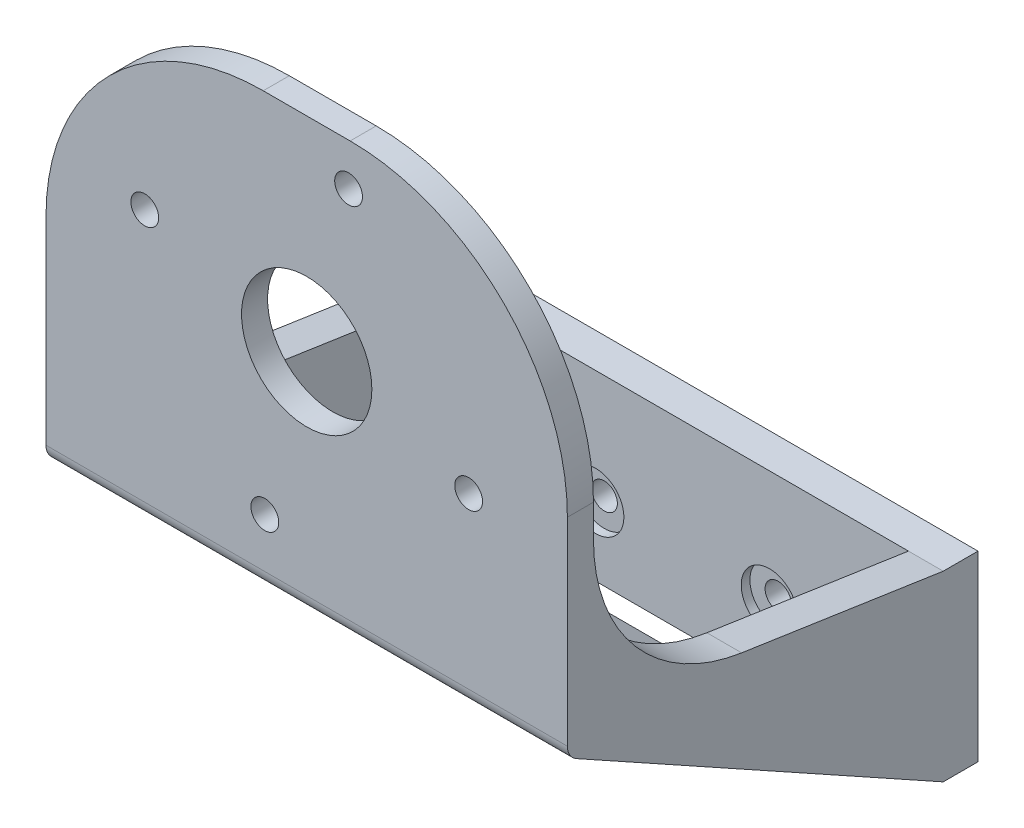
ISO-10303-21;
HEADER;
FILE_DESCRIPTION(('STEP AP214'),'2;1');
FILE_NAME('part.step','',(''),(''),'','','');
FILE_SCHEMA(('AUTOMOTIVE_DESIGN { 1 0 10303 214 1 1 1 1 }'));
ENDSEC;
DATA;
#1=APPLICATION_CONTEXT('core data for automotive mechanical design processes');
#2=APPLICATION_PROTOCOL_DEFINITION('international standard','automotive_design',2000,#1);
#3=PRODUCT_CONTEXT('',#1,'mechanical');
#4=PRODUCT('Part','Part','',(#3));
#5=PRODUCT_RELATED_PRODUCT_CATEGORY('part','',(#4));
#6=PRODUCT_DEFINITION_FORMATION('','',#4);
#7=PRODUCT_DEFINITION_CONTEXT('part definition',#1,'design');
#8=PRODUCT_DEFINITION('design','',#6,#7);
#9=PRODUCT_DEFINITION_SHAPE('','',#8);
#10=(LENGTH_UNIT() NAMED_UNIT(*) SI_UNIT(.MILLI.,.METRE.));
#11=(NAMED_UNIT(*) PLANE_ANGLE_UNIT() SI_UNIT($,.RADIAN.));
#12=(NAMED_UNIT(*) SI_UNIT($,.STERADIAN.) SOLID_ANGLE_UNIT());
#13=UNCERTAINTY_MEASURE_WITH_UNIT(LENGTH_MEASURE(1.E-05),#10,'distance_accuracy_value','');
#14=(GEOMETRIC_REPRESENTATION_CONTEXT(3) GLOBAL_UNCERTAINTY_ASSIGNED_CONTEXT((#13)) GLOBAL_UNIT_ASSIGNED_CONTEXT((#10,
#11,#12)) REPRESENTATION_CONTEXT('',''));
#15=CARTESIAN_POINT('',(0.,0.,0.));
#16=DIRECTION('',(0.,0.,1.));
#17=DIRECTION('',(1.,0.,0.));
#18=AXIS2_PLACEMENT_3D('',#15,#16,#17);
#19=CARTESIAN_POINT('',(0.,0.,4.));
#20=DIRECTION('',(0.,0.,1.));
#21=DIRECTION('',(1.,0.,0.));
#22=AXIS2_PLACEMENT_3D('',#19,#20,#21);
#23=PLANE('',#22);
#24=CARTESIAN_POINT('',(-10.,0.,4.));
#25=DIRECTION('',(0.,0.,1.));
#26=DIRECTION('',(1.,0.,0.));
#27=AXIS2_PLACEMENT_3D('',#24,#25,#26);
#28=CIRCLE('',#27,3.25);
#29=CARTESIAN_POINT('',(-6.75,0.,4.));
#30=VERTEX_POINT('',#29);
#31=EDGE_CURVE('E328',#30,#30,#28,.T.);
#32=ORIENTED_EDGE('',*,*,#31,.F.);
#33=EDGE_LOOP('',(#32));
#34=FACE_BOUND('',#33,.T.);
#35=CARTESIAN_POINT('',(10.,0.,4.));
#36=DIRECTION('',(0.,0.,1.));
#37=DIRECTION('',(1.,0.,0.));
#38=AXIS2_PLACEMENT_3D('',#35,#36,#37);
#39=CIRCLE('',#38,3.25);
#40=CARTESIAN_POINT('',(13.25,0.,4.));
#41=VERTEX_POINT('',#40);
#42=EDGE_CURVE('E332',#41,#41,#39,.T.);
#43=ORIENTED_EDGE('',*,*,#42,.F.);
#44=EDGE_LOOP('',(#43));
#45=FACE_BOUND('',#44,.T.);
#46=DIRECTION('',(1.,0.,0.));
#47=VECTOR('',#46,1.);
#48=CARTESIAN_POINT('',(0.,-8.,4.));
#49=LINE('',#48,#47);
#50=CARTESIAN_POINT('',(-25.9999999999999,-8.,4.));
#51=VERTEX_POINT('',#50);
#52=CARTESIAN_POINT('',(26.0000000000001,-8.,4.));
#53=VERTEX_POINT('',#52);
#54=EDGE_CURVE('E342',#51,#53,#49,.T.);
#55=ORIENTED_EDGE('',*,*,#54,.T.);
#56=DIRECTION('',(0.,-1.,0.));
#57=VECTOR('',#56,1.);
#58=CARTESIAN_POINT('',(26.0000000000001,0.,4.));
#59=LINE('',#58,#57);
#60=CARTESIAN_POINT('',(26.0000000000001,13.,4.));
#61=VERTEX_POINT('',#60);
#62=EDGE_CURVE('E259',#61,#53,#59,.T.);
#63=ORIENTED_EDGE('',*,*,#62,.F.);
#64=DIRECTION('',(1.,0.,0.));
#65=VECTOR('',#64,1.);
#66=CARTESIAN_POINT('',(0.,13.,4.));
#67=LINE('',#66,#65);
#68=CARTESIAN_POINT('',(-25.9999999999999,13.,4.));
#69=VERTEX_POINT('',#68);
#70=EDGE_CURVE('E343',#69,#61,#67,.T.);
#71=ORIENTED_EDGE('',*,*,#70,.F.);
#72=DIRECTION('',(0.,1.,0.));
#73=VECTOR('',#72,1.);
#74=CARTESIAN_POINT('',(-25.9999999999999,0.,4.));
#75=LINE('',#74,#73);
#76=EDGE_CURVE('E298',#51,#69,#75,.T.);
#77=ORIENTED_EDGE('',*,*,#76,.F.);
#78=EDGE_LOOP('',(#55,#63,#71,#77));
#79=FACE_BOUND('',#78,.T.);
#80=ADVANCED_FACE('F45',(#34,#45,#79),#23,.T.);
#81=CARTESIAN_POINT('',(-10.,0.,4.));
#82=DIRECTION('',(0.,0.,-1.));
#83=DIRECTION('',(-1.,0.,0.));
#84=AXIS2_PLACEMENT_3D('',#81,#82,#83);
#85=CYLINDRICAL_SURFACE('',#84,1.5);
#86=CARTESIAN_POINT('',(-10.,0.,0.));
#87=DIRECTION('',(0.,0.,1.));
#88=DIRECTION('',(1.,0.,0.));
#89=AXIS2_PLACEMENT_3D('',#86,#87,#88);
#90=CIRCLE('',#89,1.5);
#91=CARTESIAN_POINT('',(-8.5,0.,0.));
#92=VERTEX_POINT('',#91);
#93=EDGE_CURVE('E353',#92,#92,#90,.T.);
#94=ORIENTED_EDGE('',*,*,#93,.F.);
#95=EDGE_LOOP('',(#94));
#96=FACE_BOUND('',#95,.T.);
#97=CARTESIAN_POINT('',(-10.,0.,3.));
#98=DIRECTION('',(0.,0.,1.));
#99=DIRECTION('',(1.,0.,0.));
#100=AXIS2_PLACEMENT_3D('',#97,#98,#99);
#101=CIRCLE('',#100,1.5);
#102=CARTESIAN_POINT('',(-8.5,0.,3.));
#103=VERTEX_POINT('',#102);
#104=EDGE_CURVE('E354',#103,#103,#101,.T.);
#105=ORIENTED_EDGE('',*,*,#104,.T.);
#106=EDGE_LOOP('',(#105));
#107=FACE_BOUND('',#106,.T.);
#108=ADVANCED_FACE('F625',(#96,#107),#85,.F.);
#109=CARTESIAN_POINT('',(10.,0.,4.));
#110=DIRECTION('',(0.,0.,-1.));
#111=DIRECTION('',(-1.,0.,0.));
#112=AXIS2_PLACEMENT_3D('',#109,#110,#111);
#113=CYLINDRICAL_SURFACE('',#112,1.5);
#114=CARTESIAN_POINT('',(10.,0.,0.));
#115=DIRECTION('',(0.,0.,1.));
#116=DIRECTION('',(1.,0.,0.));
#117=AXIS2_PLACEMENT_3D('',#114,#115,#116);
#118=CIRCLE('',#117,1.5);
#119=CARTESIAN_POINT('',(11.5,0.,0.));
#120=VERTEX_POINT('',#119);
#121=EDGE_CURVE('E349',#120,#120,#118,.T.);
#122=ORIENTED_EDGE('',*,*,#121,.F.);
#123=EDGE_LOOP('',(#122));
#124=FACE_BOUND('',#123,.T.);
#125=CARTESIAN_POINT('',(10.,0.,3.));
#126=DIRECTION('',(0.,0.,1.));
#127=DIRECTION('',(1.,0.,0.));
#128=AXIS2_PLACEMENT_3D('',#125,#126,#127);
#129=CIRCLE('',#128,1.5);
#130=CARTESIAN_POINT('',(11.5,0.,3.));
#131=VERTEX_POINT('',#130);
#132=EDGE_CURVE('E327',#131,#131,#129,.T.);
#133=ORIENTED_EDGE('',*,*,#132,.T.);
#134=EDGE_LOOP('',(#133));
#135=FACE_BOUND('',#134,.T.);
#136=ADVANCED_FACE('F631',(#124,#135),#113,.F.);
#137=CARTESIAN_POINT('',(30.0000000000001,0.,4.));
#138=DIRECTION('',(1.,0.,0.));
#139=DIRECTION('',(0.,1.,0.));
#140=AXIS2_PLACEMENT_3D('',#137,#138,#139);
#141=PLANE('',#140);
#142=DIRECTION('',(0.,-1.,0.));
#143=VECTOR('',#142,1.);
#144=CARTESIAN_POINT('',(30.0000000000001,0.,47.25));
#145=LINE('',#144,#143);
#146=CARTESIAN_POINT('',(30.0000000000001,40.,47.25));
#147=VERTEX_POINT('',#146);
#148=CARTESIAN_POINT('',(30.0000000000001,17.1774676763382,47.25));
#149=VERTEX_POINT('',#148);
#150=EDGE_CURVE('E251',#147,#149,#145,.T.);
#151=ORIENTED_EDGE('',*,*,#150,.T.);
#152=CARTESIAN_POINT('',(30.0000000000001,17.1774676763382,45.25));
#153=DIRECTION('',(1.,0.,0.));
#154=DIRECTION('',(0.,1.,0.));
#155=AXIS2_PLACEMENT_3D('',#152,#153,#154);
#156=CIRCLE('',#155,2.);
#157=CARTESIAN_POINT('',(30.0000000000001,15.4286765130957,46.220427466308));
#158=VERTEX_POINT('',#157);
#159=EDGE_CURVE('E11',#149,#158,#156,.T.);
#160=ORIENTED_EDGE('',*,*,#159,.T.);
#161=DIRECTION('',(0.,-0.48521373315399,-0.874395581621253));
#162=VECTOR('',#161,1.);
#163=CARTESIAN_POINT('',(30.0000000000001,-7.81361604291738,4.33587942265935));
#164=LINE('',#163,#162);
#165=CARTESIAN_POINT('',(30.,-8.,4.));
#166=VERTEX_POINT('',#165);
#167=EDGE_CURVE('E271',#158,#166,#164,.T.);
#168=ORIENTED_EDGE('',*,*,#167,.T.);
#169=DIRECTION('',(0.,0.,-1.));
#170=VECTOR('',#169,1.);
#171=CARTESIAN_POINT('',(30.,-8.,4.));
#172=LINE('',#171,#170);
#173=CARTESIAN_POINT('',(30.,-8.,0.));
#174=VERTEX_POINT('',#173);
#175=EDGE_CURVE('E348',#166,#174,#172,.T.);
#176=ORIENTED_EDGE('',*,*,#175,.T.);
#177=DIRECTION('',(0.,-1.,0.));
#178=VECTOR('',#177,1.);
#179=CARTESIAN_POINT('',(30.0000000000001,0.,0.));
#180=LINE('',#179,#178);
#181=CARTESIAN_POINT('',(30.,13.,0.));
#182=VERTEX_POINT('',#181);
#183=EDGE_CURVE('E358',#182,#174,#180,.T.);
#184=ORIENTED_EDGE('',*,*,#183,.F.);
#185=DIRECTION('',(0.,0.,-1.));
#186=VECTOR('',#185,1.);
#187=CARTESIAN_POINT('',(30.,13.,4.));
#188=LINE('',#187,#186);
#189=CARTESIAN_POINT('',(30.0000000000001,13.,4.));
#190=VERTEX_POINT('',#189);
#191=EDGE_CURVE('E383',#190,#182,#188,.T.);
#192=ORIENTED_EDGE('',*,*,#191,.F.);
#193=DIRECTION('',(0.,0.147439173889974,0.989071124845247));
#194=VECTOR('',#193,1.);
#195=CARTESIAN_POINT('',(30.0000000000001,12.1340906517719,-1.80880854436351));
#196=LINE('',#195,#194);
#197=CARTESIAN_POINT('',(30.0000000000001,16.4582037482434,27.1987834777995));
#198=VERTEX_POINT('',#197);
#199=EDGE_CURVE('E274',#190,#198,#196,.T.);
#200=ORIENTED_EDGE('',*,*,#199,.T.);
#201=CARTESIAN_POINT('',(30.0000000000001,36.2396262451483,24.25));
#202=DIRECTION('',(1.,0.,0.));
#203=DIRECTION('',(0.,1.,0.));
#204=AXIS2_PLACEMENT_3D('',#201,#202,#203);
#205=CIRCLE('',#204,20.);
#206=CARTESIAN_POINT('',(30.0000000000001,36.2396262451483,44.25));
#207=VERTEX_POINT('',#206);
#208=EDGE_CURVE('E438',#198,#207,#205,.F.);
#209=ORIENTED_EDGE('',*,*,#208,.T.);
#210=DIRECTION('',(0.,1.,0.));
#211=VECTOR('',#210,1.);
#212=CARTESIAN_POINT('',(30.0000000000001,0.,44.25));
#213=LINE('',#212,#211);
#214=CARTESIAN_POINT('',(30.0000000000001,40.,44.25));
#215=VERTEX_POINT('',#214);
#216=EDGE_CURVE('E278',#207,#215,#213,.T.);
#217=ORIENTED_EDGE('',*,*,#216,.T.);
#218=DIRECTION('',(0.,0.,1.));
#219=VECTOR('',#218,1.);
#220=CARTESIAN_POINT('',(30.0000000000001,40.,47.25));
#221=LINE('',#220,#219);
#222=EDGE_CURVE('E395',#215,#147,#221,.T.);
#223=ORIENTED_EDGE('',*,*,#222,.T.);
#224=EDGE_LOOP('',(#151,#160,#168,#176,#184,#192,#200,#209,#217,#223));
#225=FACE_BOUND('',#224,.T.);
#226=ADVANCED_FACE('F567',(#225),#141,.T.);
#227=CARTESIAN_POINT('',(0.,13.,4.));
#228=DIRECTION('',(0.,1.,0.));
#229=DIRECTION('',(0.,0.,1.));
#230=AXIS2_PLACEMENT_3D('',#227,#228,#229);
#231=PLANE('',#230);
#232=DIRECTION('',(1.,0.,0.));
#233=VECTOR('',#232,1.);
#234=CARTESIAN_POINT('',(0.,13.,0.));
#235=LINE('',#234,#233);
#236=CARTESIAN_POINT('',(-30.,13.,0.));
#237=VERTEX_POINT('',#236);
#238=EDGE_CURVE('E362',#237,#182,#235,.T.);
#239=ORIENTED_EDGE('',*,*,#238,.F.);
#240=DIRECTION('',(0.,0.,-1.));
#241=VECTOR('',#240,1.);
#242=CARTESIAN_POINT('',(-30.,13.,4.));
#243=LINE('',#242,#241);
#244=CARTESIAN_POINT('',(-30.,13.,4.));
#245=VERTEX_POINT('',#244);
#246=EDGE_CURVE('E380',#245,#237,#243,.T.);
#247=ORIENTED_EDGE('',*,*,#246,.F.);
#248=EDGE_CURVE('E339',#245,#69,#67,.T.);
#249=ORIENTED_EDGE('',*,*,#248,.T.);
#250=ORIENTED_EDGE('',*,*,#70,.T.);
#251=DIRECTION('',(1.,0.,0.));
#252=VECTOR('',#251,1.);
#253=CARTESIAN_POINT('',(26.0000000000001,13.,4.));
#254=LINE('',#253,#252);
#255=EDGE_CURVE('E281',#61,#190,#254,.T.);
#256=ORIENTED_EDGE('',*,*,#255,.T.);
#257=ORIENTED_EDGE('',*,*,#191,.T.);
#258=EDGE_LOOP('',(#239,#247,#249,#250,#256,#257));
#259=FACE_BOUND('',#258,.T.);
#260=ADVANCED_FACE('F583',(#259),#231,.T.);
#261=CARTESIAN_POINT('',(-29.9999999999999,0.,4.));
#262=DIRECTION('',(1.,0.,0.));
#263=DIRECTION('',(0.,1.,0.));
#264=AXIS2_PLACEMENT_3D('',#261,#262,#263);
#265=PLANE('',#264);
#266=DIRECTION('',(0.,-0.48521373315399,-0.874395581621253));
#267=VECTOR('',#266,1.);
#268=CARTESIAN_POINT('',(-29.9999999999999,-7.81361604291736,4.33587942265935));
#269=LINE('',#268,#267);
#270=CARTESIAN_POINT('',(-29.9999999999999,15.4286765130958,46.220427466308));
#271=VERTEX_POINT('',#270);
#272=CARTESIAN_POINT('',(-30.,-8.,4.));
#273=VERTEX_POINT('',#272);
#274=EDGE_CURVE('E285',#271,#273,#269,.T.);
#275=ORIENTED_EDGE('',*,*,#274,.F.);
#276=CARTESIAN_POINT('',(-29.9999999999999,17.1774676763382,45.25));
#277=DIRECTION('',(1.,0.,0.));
#278=DIRECTION('',(0.,1.,0.));
#279=AXIS2_PLACEMENT_3D('',#276,#277,#278);
#280=CIRCLE('',#279,2.);
#281=CARTESIAN_POINT('',(-29.9999999999999,17.1774676763382,47.25));
#282=VERTEX_POINT('',#281);
#283=EDGE_CURVE('E68',#271,#282,#280,.F.);
#284=ORIENTED_EDGE('',*,*,#283,.T.);
#285=DIRECTION('',(0.,-1.,0.));
#286=VECTOR('',#285,1.);
#287=CARTESIAN_POINT('',(-29.9999999999999,0.,47.25));
#288=LINE('',#287,#286);
#289=CARTESIAN_POINT('',(-29.9999999999999,40.,47.25));
#290=VERTEX_POINT('',#289);
#291=EDGE_CURVE('E305',#290,#282,#288,.T.);
#292=ORIENTED_EDGE('',*,*,#291,.F.);
#293=DIRECTION('',(0.,0.,1.));
#294=VECTOR('',#293,1.);
#295=CARTESIAN_POINT('',(-29.9999999999999,40.,4.));
#296=LINE('',#295,#294);
#297=CARTESIAN_POINT('',(-29.9999999999999,40.,44.25));
#298=VERTEX_POINT('',#297);
#299=EDGE_CURVE('E419',#290,#298,#296,.F.);
#300=ORIENTED_EDGE('',*,*,#299,.T.);
#301=DIRECTION('',(0.,1.,0.));
#302=VECTOR('',#301,1.);
#303=CARTESIAN_POINT('',(-29.9999999999999,0.,44.25));
#304=LINE('',#303,#302);
#305=CARTESIAN_POINT('',(-29.9999999999999,36.2396262451483,44.25));
#306=VERTEX_POINT('',#305);
#307=EDGE_CURVE('E308',#306,#298,#304,.T.);
#308=ORIENTED_EDGE('',*,*,#307,.F.);
#309=CARTESIAN_POINT('',(-29.9999999999999,36.2396262451483,24.25));
#310=DIRECTION('',(1.,0.,0.));
#311=DIRECTION('',(0.,1.,0.));
#312=AXIS2_PLACEMENT_3D('',#309,#310,#311);
#313=CIRCLE('',#312,20.);
#314=CARTESIAN_POINT('',(-29.9999999999999,16.4582037482434,27.1987834777995));
#315=VERTEX_POINT('',#314);
#316=EDGE_CURVE('E444',#306,#315,#313,.T.);
#317=ORIENTED_EDGE('',*,*,#316,.T.);
#318=DIRECTION('',(0.,0.147439173889975,0.989071124845247));
#319=VECTOR('',#318,1.);
#320=CARTESIAN_POINT('',(-29.9999999999999,12.1340906517719,-1.80880854436351));
#321=LINE('',#320,#319);
#322=EDGE_CURVE('E311',#245,#315,#321,.T.);
#323=ORIENTED_EDGE('',*,*,#322,.F.);
#324=ORIENTED_EDGE('',*,*,#246,.T.);
#325=DIRECTION('',(0.,-1.,0.));
#326=VECTOR('',#325,1.);
#327=CARTESIAN_POINT('',(-29.9999999999999,0.,0.));
#328=LINE('',#327,#326);
#329=CARTESIAN_POINT('',(-30.,-8.,0.));
#330=VERTEX_POINT('',#329);
#331=EDGE_CURVE('E366',#237,#330,#328,.T.);
#332=ORIENTED_EDGE('',*,*,#331,.T.);
#333=DIRECTION('',(0.,0.,-1.));
#334=VECTOR('',#333,1.);
#335=CARTESIAN_POINT('',(-30.,-8.,4.));
#336=LINE('',#335,#334);
#337=EDGE_CURVE('E376',#273,#330,#336,.T.);
#338=ORIENTED_EDGE('',*,*,#337,.F.);
#339=EDGE_LOOP('',(#275,#284,#292,#300,#308,#317,#323,#324,#332,#338));
#340=FACE_BOUND('',#339,.T.);
#341=ADVANCED_FACE('F596',(#340),#265,.F.);
#342=CARTESIAN_POINT('',(0.,-8.,4.));
#343=DIRECTION('',(0.,1.,0.));
#344=DIRECTION('',(0.,0.,1.));
#345=AXIS2_PLACEMENT_3D('',#342,#343,#344);
#346=PLANE('',#345);
#347=DIRECTION('',(1.,0.,0.));
#348=VECTOR('',#347,1.);
#349=CARTESIAN_POINT('',(0.,-8.,0.));
#350=LINE('',#349,#348);
#351=EDGE_CURVE('E370',#330,#174,#350,.T.);
#352=ORIENTED_EDGE('',*,*,#351,.T.);
#353=ORIENTED_EDGE('',*,*,#175,.F.);
#354=DIRECTION('',(1.,0.,0.));
#355=VECTOR('',#354,1.);
#356=CARTESIAN_POINT('',(26.0000000000001,-8.,4.));
#357=LINE('',#356,#355);
#358=EDGE_CURVE('E268',#53,#166,#357,.T.);
#359=ORIENTED_EDGE('',*,*,#358,.F.);
#360=ORIENTED_EDGE('',*,*,#54,.F.);
#361=EDGE_CURVE('E344',#273,#51,#49,.T.);
#362=ORIENTED_EDGE('',*,*,#361,.F.);
#363=ORIENTED_EDGE('',*,*,#337,.T.);
#364=EDGE_LOOP('',(#352,#353,#359,#360,#362,#363));
#365=FACE_BOUND('',#364,.T.);
#366=ADVANCED_FACE('F575',(#365),#346,.F.);
#367=CARTESIAN_POINT('',(0.,0.,0.));
#368=DIRECTION('',(0.,0.,1.));
#369=DIRECTION('',(1.,0.,0.));
#370=AXIS2_PLACEMENT_3D('',#367,#368,#369);
#371=PLANE('',#370);
#372=ORIENTED_EDGE('',*,*,#121,.T.);
#373=EDGE_LOOP('',(#372));
#374=FACE_BOUND('',#373,.T.);
#375=ORIENTED_EDGE('',*,*,#93,.T.);
#376=EDGE_LOOP('',(#375));
#377=FACE_BOUND('',#376,.T.);
#378=ORIENTED_EDGE('',*,*,#183,.T.);
#379=ORIENTED_EDGE('',*,*,#351,.F.);
#380=ORIENTED_EDGE('',*,*,#331,.F.);
#381=ORIENTED_EDGE('',*,*,#238,.T.);
#382=EDGE_LOOP('',(#378,#379,#380,#381));
#383=FACE_BOUND('',#382,.T.);
#384=ADVANCED_FACE('F581',(#374,#377,#383),#371,.F.);
#385=CARTESIAN_POINT('',(10.,0.,3.));
#386=DIRECTION('',(0.,0.,1.));
#387=DIRECTION('',(1.,0.,0.));
#388=AXIS2_PLACEMENT_3D('',#385,#386,#387);
#389=CYLINDRICAL_SURFACE('',#388,3.25);
#390=CARTESIAN_POINT('',(10.,0.,3.));
#391=DIRECTION('',(0.,0.,1.));
#392=DIRECTION('',(1.,0.,0.));
#393=AXIS2_PLACEMENT_3D('',#390,#391,#392);
#394=CIRCLE('',#393,3.25);
#395=CARTESIAN_POINT('',(13.25,0.,3.));
#396=VERTEX_POINT('',#395);
#397=EDGE_CURVE('E319',#396,#396,#394,.T.);
#398=ORIENTED_EDGE('',*,*,#397,.F.);
#399=EDGE_LOOP('',(#398));
#400=FACE_BOUND('',#399,.T.);
#401=ORIENTED_EDGE('',*,*,#42,.T.);
#402=EDGE_LOOP('',(#401));
#403=FACE_BOUND('',#402,.T.);
#404=ADVANCED_FACE('F642',(#400,#403),#389,.F.);
#405=CARTESIAN_POINT('',(10.,0.,3.));
#406=DIRECTION('',(0.,0.,1.));
#407=DIRECTION('',(1.,0.,0.));
#408=AXIS2_PLACEMENT_3D('',#405,#406,#407);
#409=PLANE('',#408);
#410=ORIENTED_EDGE('',*,*,#132,.F.);
#411=EDGE_LOOP('',(#410));
#412=FACE_BOUND('',#411,.T.);
#413=ORIENTED_EDGE('',*,*,#397,.T.);
#414=EDGE_LOOP('',(#413));
#415=FACE_BOUND('',#414,.T.);
#416=ADVANCED_FACE('F638',(#412,#415),#409,.T.);
#417=CARTESIAN_POINT('',(-10.,0.,3.));
#418=DIRECTION('',(0.,0.,1.));
#419=DIRECTION('',(1.,0.,0.));
#420=AXIS2_PLACEMENT_3D('',#417,#418,#419);
#421=CYLINDRICAL_SURFACE('',#420,3.25);
#422=CARTESIAN_POINT('',(-10.,0.,3.));
#423=DIRECTION('',(0.,0.,1.));
#424=DIRECTION('',(1.,0.,0.));
#425=AXIS2_PLACEMENT_3D('',#422,#423,#424);
#426=CIRCLE('',#425,3.25);
#427=CARTESIAN_POINT('',(-6.75,0.,3.));
#428=VERTEX_POINT('',#427);
#429=EDGE_CURVE('E323',#428,#428,#426,.T.);
#430=ORIENTED_EDGE('',*,*,#429,.F.);
#431=EDGE_LOOP('',(#430));
#432=FACE_BOUND('',#431,.T.);
#433=ORIENTED_EDGE('',*,*,#31,.T.);
#434=EDGE_LOOP('',(#433));
#435=FACE_BOUND('',#434,.T.);
#436=ADVANCED_FACE('F712',(#432,#435),#421,.F.);
#437=CARTESIAN_POINT('',(-10.,0.,3.));
#438=DIRECTION('',(0.,0.,1.));
#439=DIRECTION('',(1.,0.,0.));
#440=AXIS2_PLACEMENT_3D('',#437,#438,#439);
#441=PLANE('',#440);
#442=ORIENTED_EDGE('',*,*,#104,.F.);
#443=EDGE_LOOP('',(#442));
#444=FACE_BOUND('',#443,.T.);
#445=ORIENTED_EDGE('',*,*,#429,.T.);
#446=EDGE_LOOP('',(#445));
#447=FACE_BOUND('',#446,.T.);
#448=ADVANCED_FACE('F709',(#444,#447),#441,.T.);
#449=CARTESIAN_POINT('',(-25.9999999999999,-7.81361604291736,4.33587942265935));
#450=DIRECTION('',(0.,0.874395581621253,-0.48521373315399));
#451=DIRECTION('',(0.,0.48521373315399,0.874395581621253));
#452=AXIS2_PLACEMENT_3D('',#449,#450,#451);
#453=PLANE('',#452);
#454=ORIENTED_EDGE('',*,*,#167,.F.);
#455=DIRECTION('',(-1.,0.,0.));
#456=VECTOR('',#455,1.);
#457=CARTESIAN_POINT('',(-25.9999999999999,15.4286765130957,46.220427466308));
#458=LINE('',#457,#456);
#459=EDGE_CURVE('E489',#158,#271,#458,.T.);
#460=ORIENTED_EDGE('',*,*,#459,.T.);
#461=ORIENTED_EDGE('',*,*,#274,.T.);
#462=ORIENTED_EDGE('',*,*,#361,.T.);
#463=DIRECTION('',(0.,-0.48521373315399,-0.874395581621253));
#464=VECTOR('',#463,1.);
#465=CARTESIAN_POINT('',(-25.9999999999999,-7.81361604291736,4.33587942265935));
#466=LINE('',#465,#464);
#467=CARTESIAN_POINT('',(-25.9999999999999,0.92653568959635,20.0863611906268));
#468=VERTEX_POINT('',#467);
#469=EDGE_CURVE('E294',#468,#51,#466,.T.);
#470=ORIENTED_EDGE('',*,*,#469,.F.);
#471=DIRECTION('',(-1.,0.,0.));
#472=VECTOR('',#471,1.);
#473=CARTESIAN_POINT('',(-25.9999999999999,0.92653568959635,20.0863611906268));
#474=LINE('',#473,#472);
#475=CARTESIAN_POINT('',(26.0000000000001,0.926535689596332,20.0863611906268));
#476=VERTEX_POINT('',#475);
#477=EDGE_CURVE('E479',#468,#476,#474,.F.);
#478=ORIENTED_EDGE('',*,*,#477,.T.);
#479=DIRECTION('',(0.,-0.48521373315399,-0.874395581621253));
#480=VECTOR('',#479,1.);
#481=CARTESIAN_POINT('',(26.0000000000001,-7.81361604291738,4.33587942265935));
#482=LINE('',#481,#480);
#483=EDGE_CURVE('E260',#476,#53,#482,.T.);
#484=ORIENTED_EDGE('',*,*,#483,.T.);
#485=ORIENTED_EDGE('',*,*,#358,.T.);
#486=EDGE_LOOP('',(#454,#460,#461,#462,#470,#478,#484,#485));
#487=FACE_BOUND('',#486,.T.);
#488=CARTESIAN_POINT('',(26.0000000000001,14.3352601156069,44.25));
#489=VERTEX_POINT('',#488);
#490=CARTESIAN_POINT('',(26.0000000000001,11.8937630593136,39.8502188464714));
#491=VERTEX_POINT('',#490);
#492=EDGE_CURVE('E255',#489,#491,#482,.T.);
#493=ORIENTED_EDGE('',*,*,#492,.T.);
#494=CARTESIAN_POINT('',(20.0000000000001,11.8937630593136,39.8502188464714));
#495=DIRECTION('',(0.,0.874395581621253,-0.48521373315399));
#496=DIRECTION('',(0.,0.48521373315399,0.874395581621253));
#497=AXIS2_PLACEMENT_3D('',#494,#495,#496);
#498=CIRCLE('',#497,6.);
#499=CARTESIAN_POINT('',(20.0000000000001,8.98248066038964,34.6038453567439));
#500=VERTEX_POINT('',#499);
#501=EDGE_CURVE('E467',#491,#500,#498,.T.);
#502=ORIENTED_EDGE('',*,*,#501,.T.);
#503=DIRECTION('',(-1.,0.,0.));
#504=VECTOR('',#503,1.);
#505=CARTESIAN_POINT('',(47.3961061417223,8.98248066038963,34.6038453567439));
#506=LINE('',#505,#504);
#507=CARTESIAN_POINT('',(-19.9999999999999,8.98248066038965,34.6038453567439));
#508=VERTEX_POINT('',#507);
#509=EDGE_CURVE('E242',#500,#508,#506,.T.);
#510=ORIENTED_EDGE('',*,*,#509,.T.);
#511=CARTESIAN_POINT('',(-19.9999999999999,11.8937630593136,39.8502188464713));
#512=DIRECTION('',(0.,0.874395581621253,-0.48521373315399));
#513=DIRECTION('',(0.,0.48521373315399,0.874395581621253));
#514=AXIS2_PLACEMENT_3D('',#511,#512,#513);
#515=CIRCLE('',#514,6.);
#516=CARTESIAN_POINT('',(-25.9999999999999,11.8937630593136,39.8502188464714));
#517=VERTEX_POINT('',#516);
#518=EDGE_CURVE('E473',#508,#517,#515,.T.);
#519=ORIENTED_EDGE('',*,*,#518,.T.);
#520=CARTESIAN_POINT('',(-25.9999999999999,14.3352601156069,44.25));
#521=VERTEX_POINT('',#520);
#522=EDGE_CURVE('E289',#521,#517,#466,.T.);
#523=ORIENTED_EDGE('',*,*,#522,.F.);
#524=DIRECTION('',(-1.,0.,0.));
#525=VECTOR('',#524,1.);
#526=CARTESIAN_POINT('',(76.7534813343205,14.3352601156069,44.25));
#527=LINE('',#526,#525);
#528=EDGE_CURVE('E246',#489,#521,#527,.T.);
#529=ORIENTED_EDGE('',*,*,#528,.F.);
#530=EDGE_LOOP('',(#493,#502,#510,#519,#523,#529));
#531=FACE_BOUND('',#530,.T.);
#532=ADVANCED_FACE('F569',(#487,#531),#453,.F.);
#533=CARTESIAN_POINT('',(-25.9999999999999,12.1340906517719,-1.80880854436351));
#534=DIRECTION('',(0.,-0.989071124845247,0.147439173889975));
#535=DIRECTION('',(0.,-0.147439173889975,-0.989071124845247));
#536=AXIS2_PLACEMENT_3D('',#533,#534,#535);
#537=PLANE('',#536);
#538=ORIENTED_EDGE('',*,*,#322,.T.);
#539=DIRECTION('',(-1.,0.,0.));
#540=VECTOR('',#539,1.);
#541=CARTESIAN_POINT('',(-25.9999999999999,16.4582037482434,27.1987834777995));
#542=LINE('',#541,#540);
#543=CARTESIAN_POINT('',(-25.9999999999999,16.4582037482434,27.1987834777995));
#544=VERTEX_POINT('',#543);
#545=EDGE_CURVE('E435',#315,#544,#542,.F.);
#546=ORIENTED_EDGE('',*,*,#545,.T.);
#547=DIRECTION('',(0.,0.147439173889975,0.989071124845247));
#548=VECTOR('',#547,1.);
#549=CARTESIAN_POINT('',(-25.9999999999999,12.1340906517719,-1.80880854436351));
#550=LINE('',#549,#548);
#551=EDGE_CURVE('E293',#69,#544,#550,.T.);
#552=ORIENTED_EDGE('',*,*,#551,.F.);
#553=ORIENTED_EDGE('',*,*,#248,.F.);
#554=EDGE_LOOP('',(#538,#546,#552,#553));
#555=FACE_BOUND('',#554,.T.);
#556=ADVANCED_FACE('F601',(#555),#537,.F.);
#557=CARTESIAN_POINT('',(-25.9999999999999,0.,44.25));
#558=DIRECTION('',(0.,0.,1.));
#559=DIRECTION('',(1.,0.,0.));
#560=AXIS2_PLACEMENT_3D('',#557,#558,#559);
#561=PLANE('',#560);
#562=CARTESIAN_POINT('',(-18.6368420772822,46.3198150780499,44.25));
#563=DIRECTION('',(0.,0.,1.));
#564=DIRECTION('',(1.,0.,0.));
#565=AXIS2_PLACEMENT_3D('',#562,#563,#564);
#566=CIRCLE('',#565,1.6);
#567=CARTESIAN_POINT('',(-17.0368420772822,46.3198150780499,44.25));
#568=VERTEX_POINT('',#567);
#569=EDGE_CURVE('E219',#568,#568,#566,.T.);
#570=ORIENTED_EDGE('',*,*,#569,.T.);
#571=EDGE_LOOP('',(#570));
#572=FACE_BOUND('',#571,.T.);
#573=CARTESIAN_POINT('',(2.60208521396521E-13,41.4999999999984,44.25));
#574=DIRECTION('',(0.,0.,1.));
#575=DIRECTION('',(1.,0.,0.));
#576=AXIS2_PLACEMENT_3D('',#573,#574,#575);
#577=CIRCLE('',#576,7.50000000000003);
#578=CARTESIAN_POINT('',(7.50000000000029,41.4999999999984,44.25));
#579=VERTEX_POINT('',#578);
#580=EDGE_CURVE('E508',#579,#579,#577,.T.);
#581=ORIENTED_EDGE('',*,*,#580,.T.);
#582=EDGE_LOOP('',(#581));
#583=FACE_BOUND('',#582,.T.);
#584=CARTESIAN_POINT('',(4.81981507805186,60.1368420772809,44.25));
#585=DIRECTION('',(0.,0.,1.));
#586=DIRECTION('',(1.,0.,0.));
#587=AXIS2_PLACEMENT_3D('',#584,#585,#586);
#588=CIRCLE('',#587,1.6);
#589=CARTESIAN_POINT('',(6.41981507805186,60.1368420772809,44.25));
#590=VERTEX_POINT('',#589);
#591=EDGE_CURVE('E512',#590,#590,#588,.T.);
#592=ORIENTED_EDGE('',*,*,#591,.T.);
#593=EDGE_LOOP('',(#592));
#594=FACE_BOUND('',#593,.T.);
#595=CARTESIAN_POINT('',(18.6368420772828,36.6801849219468,44.25));
#596=DIRECTION('',(0.,0.,1.));
#597=DIRECTION('',(1.,0.,0.));
#598=AXIS2_PLACEMENT_3D('',#595,#596,#597);
#599=CIRCLE('',#598,1.6);
#600=CARTESIAN_POINT('',(20.2368420772828,36.6801849219468,44.25));
#601=VERTEX_POINT('',#600);
#602=EDGE_CURVE('E516',#601,#601,#599,.T.);
#603=ORIENTED_EDGE('',*,*,#602,.T.);
#604=EDGE_LOOP('',(#603));
#605=FACE_BOUND('',#604,.T.);
#606=CARTESIAN_POINT('',(-4.81981507805129,22.8631579227159,44.25));
#607=DIRECTION('',(0.,0.,1.));
#608=DIRECTION('',(1.,0.,0.));
#609=AXIS2_PLACEMENT_3D('',#606,#607,#608);
#610=CIRCLE('',#609,1.6);
#611=CARTESIAN_POINT('',(-3.21981507805129,22.8631579227159,44.25));
#612=VERTEX_POINT('',#611);
#613=EDGE_CURVE('E520',#612,#612,#610,.T.);
#614=ORIENTED_EDGE('',*,*,#613,.T.);
#615=EDGE_LOOP('',(#614));
#616=FACE_BOUND('',#615,.T.);
#617=ORIENTED_EDGE('',*,*,#216,.F.);
#618=DIRECTION('',(1.,0.,0.));
#619=VECTOR('',#618,1.);
#620=CARTESIAN_POINT('',(-25.9999999999999,36.2396262451484,44.25));
#621=LINE('',#620,#619);
#622=CARTESIAN_POINT('',(26.0000000000001,36.2396262451483,44.25));
#623=VERTEX_POINT('',#622);
#624=EDGE_CURVE('E431',#207,#623,#621,.F.);
#625=ORIENTED_EDGE('',*,*,#624,.T.);
#626=DIRECTION('',(0.,1.,0.));
#627=VECTOR('',#626,1.);
#628=CARTESIAN_POINT('',(26.0000000000001,0.,44.25));
#629=LINE('',#628,#627);
#630=EDGE_CURVE('E386',#489,#623,#629,.T.);
#631=ORIENTED_EDGE('',*,*,#630,.F.);
#632=ORIENTED_EDGE('',*,*,#528,.T.);
#633=DIRECTION('',(0.,-1.,0.));
#634=VECTOR('',#633,1.);
#635=CARTESIAN_POINT('',(-25.9999999999999,0.,44.25));
#636=LINE('',#635,#634);
#637=CARTESIAN_POINT('',(-25.9999999999999,36.2396262451483,44.25));
#638=VERTEX_POINT('',#637);
#639=EDGE_CURVE('E247',#638,#521,#636,.T.);
#640=ORIENTED_EDGE('',*,*,#639,.F.);
#641=DIRECTION('',(-1.,0.,0.));
#642=VECTOR('',#641,1.);
#643=CARTESIAN_POINT('',(-29.9999999999999,36.2396262451483,44.25));
#644=LINE('',#643,#642);
#645=EDGE_CURVE('E427',#638,#306,#644,.T.);
#646=ORIENTED_EDGE('',*,*,#645,.T.);
#647=ORIENTED_EDGE('',*,*,#307,.T.);
#648=CARTESIAN_POINT('',(-4.99999999999992,40.,44.25));
#649=DIRECTION('',(0.,0.,1.));
#650=DIRECTION('',(1.,0.,0.));
#651=AXIS2_PLACEMENT_3D('',#648,#649,#650);
#652=CIRCLE('',#651,25.);
#653=CARTESIAN_POINT('',(-4.99999999999991,65.,44.25));
#654=VERTEX_POINT('',#653);
#655=EDGE_CURVE('E412',#298,#654,#652,.F.);
#656=ORIENTED_EDGE('',*,*,#655,.T.);
#657=DIRECTION('',(-1.,0.,0.));
#658=VECTOR('',#657,1.);
#659=CARTESIAN_POINT('',(-25.9999999999999,65.,44.25));
#660=LINE('',#659,#658);
#661=CARTESIAN_POINT('',(5.00000000000008,65.,44.25));
#662=VERTEX_POINT('',#661);
#663=EDGE_CURVE('E315',#662,#654,#660,.T.);
#664=ORIENTED_EDGE('',*,*,#663,.F.);
#665=CARTESIAN_POINT('',(5.00000000000007,40.,44.25));
#666=DIRECTION('',(0.,0.,1.));
#667=DIRECTION('',(1.,0.,0.));
#668=AXIS2_PLACEMENT_3D('',#665,#666,#667);
#669=CIRCLE('',#668,25.);
#670=EDGE_CURVE('E415',#662,#215,#669,.F.);
#671=ORIENTED_EDGE('',*,*,#670,.T.);
#672=EDGE_LOOP('',(#617,#625,#631,#632,#640,#646,#647,#656,#664,#671));
#673=FACE_BOUND('',#672,.T.);
#674=ADVANCED_FACE('F688',(#572,#583,#594,#605,#616,#673),#561,.F.);
#675=CARTESIAN_POINT('',(-25.9999999999999,65.,0.));
#676=DIRECTION('',(0.,-1.,0.));
#677=DIRECTION('',(1.,0.,0.));
#678=AXIS2_PLACEMENT_3D('',#675,#676,#677);
#679=PLANE('',#678);
#680=DIRECTION('',(-1.,0.,0.));
#681=VECTOR('',#680,1.);
#682=CARTESIAN_POINT('',(-25.9999999999999,65.,47.25));
#683=LINE('',#682,#681);
#684=CARTESIAN_POINT('',(5.00000000000008,65.,47.25));
#685=VERTEX_POINT('',#684);
#686=CARTESIAN_POINT('',(-4.99999999999991,65.,47.25));
#687=VERTEX_POINT('',#686);
#688=EDGE_CURVE('E302',#685,#687,#683,.T.);
#689=ORIENTED_EDGE('',*,*,#688,.F.);
#690=DIRECTION('',(0.,0.,1.));
#691=VECTOR('',#690,1.);
#692=CARTESIAN_POINT('',(5.00000000000008,65.,44.25));
#693=LINE('',#692,#691);
#694=EDGE_CURVE('E409',#685,#662,#693,.F.);
#695=ORIENTED_EDGE('',*,*,#694,.T.);
#696=ORIENTED_EDGE('',*,*,#663,.T.);
#697=DIRECTION('',(0.,0.,1.));
#698=VECTOR('',#697,1.);
#699=CARTESIAN_POINT('',(-4.99999999999991,65.,0.));
#700=LINE('',#699,#698);
#701=EDGE_CURVE('E405',#654,#687,#700,.T.);
#702=ORIENTED_EDGE('',*,*,#701,.T.);
#703=EDGE_LOOP('',(#689,#695,#696,#702));
#704=FACE_BOUND('',#703,.T.);
#705=ADVANCED_FACE('F552',(#704),#679,.F.);
#706=CARTESIAN_POINT('',(-25.9999999999999,0.,47.25));
#707=DIRECTION('',(0.,0.,-1.));
#708=DIRECTION('',(0.,1.,0.));
#709=AXIS2_PLACEMENT_3D('',#706,#707,#708);
#710=PLANE('',#709);
#711=CARTESIAN_POINT('',(-18.6368420772822,46.3198150780499,47.25));
#712=DIRECTION('',(0.,0.,1.));
#713=DIRECTION('',(1.,0.,0.));
#714=AXIS2_PLACEMENT_3D('',#711,#712,#713);
#715=CIRCLE('',#714,1.6);
#716=CARTESIAN_POINT('',(-17.0368420772822,46.3198150780499,47.25));
#717=VERTEX_POINT('',#716);
#718=EDGE_CURVE('E524',#717,#717,#715,.T.);
#719=ORIENTED_EDGE('',*,*,#718,.F.);
#720=EDGE_LOOP('',(#719));
#721=FACE_BOUND('',#720,.T.);
#722=CARTESIAN_POINT('',(2.60208521396521E-13,41.4999999999984,47.25));
#723=DIRECTION('',(0.,0.,1.));
#724=DIRECTION('',(1.,0.,0.));
#725=AXIS2_PLACEMENT_3D('',#722,#723,#724);
#726=CIRCLE('',#725,7.50000000000003);
#727=CARTESIAN_POINT('',(7.50000000000029,41.4999999999984,47.25));
#728=VERTEX_POINT('',#727);
#729=EDGE_CURVE('E534',#728,#728,#726,.T.);
#730=ORIENTED_EDGE('',*,*,#729,.F.);
#731=EDGE_LOOP('',(#730));
#732=FACE_BOUND('',#731,.T.);
#733=CARTESIAN_POINT('',(4.81981507805186,60.1368420772809,47.25));
#734=DIRECTION('',(0.,0.,1.));
#735=DIRECTION('',(1.,0.,0.));
#736=AXIS2_PLACEMENT_3D('',#733,#734,#735);
#737=CIRCLE('',#736,1.6);
#738=CARTESIAN_POINT('',(6.41981507805186,60.1368420772809,47.25));
#739=VERTEX_POINT('',#738);
#740=EDGE_CURVE('E530',#739,#739,#737,.T.);
#741=ORIENTED_EDGE('',*,*,#740,.F.);
#742=EDGE_LOOP('',(#741));
#743=FACE_BOUND('',#742,.T.);
#744=CARTESIAN_POINT('',(18.6368420772828,36.6801849219468,47.25));
#745=DIRECTION('',(0.,0.,1.));
#746=DIRECTION('',(1.,0.,0.));
#747=AXIS2_PLACEMENT_3D('',#744,#745,#746);
#748=CIRCLE('',#747,1.6);
#749=CARTESIAN_POINT('',(20.2368420772828,36.6801849219468,47.25));
#750=VERTEX_POINT('',#749);
#751=EDGE_CURVE('E525',#750,#750,#748,.T.);
#752=ORIENTED_EDGE('',*,*,#751,.F.);
#753=EDGE_LOOP('',(#752));
#754=FACE_BOUND('',#753,.T.);
#755=CARTESIAN_POINT('',(-4.81981507805129,22.8631579227159,47.25));
#756=DIRECTION('',(0.,0.,1.));
#757=DIRECTION('',(1.,0.,0.));
#758=AXIS2_PLACEMENT_3D('',#755,#756,#757);
#759=CIRCLE('',#758,1.6);
#760=CARTESIAN_POINT('',(-3.21981507805129,22.8631579227159,47.25));
#761=VERTEX_POINT('',#760);
#762=EDGE_CURVE('E529',#761,#761,#759,.T.);
#763=ORIENTED_EDGE('',*,*,#762,.F.);
#764=EDGE_LOOP('',(#763));
#765=FACE_BOUND('',#764,.T.);
#766=ORIENTED_EDGE('',*,*,#291,.T.);
#767=DIRECTION('',(-1.,0.,0.));
#768=VECTOR('',#767,1.);
#769=CARTESIAN_POINT('',(-25.9999999999999,17.1774676763382,47.25));
#770=LINE('',#769,#768);
#771=EDGE_CURVE('E54',#282,#149,#770,.F.);
#772=ORIENTED_EDGE('',*,*,#771,.T.);
#773=ORIENTED_EDGE('',*,*,#150,.F.);
#774=CARTESIAN_POINT('',(5.00000000000007,40.,47.25));
#775=DIRECTION('',(0.,0.,-1.));
#776=DIRECTION('',(0.,1.,0.));
#777=AXIS2_PLACEMENT_3D('',#774,#775,#776);
#778=CIRCLE('',#777,25.);
#779=EDGE_CURVE('E402',#147,#685,#778,.F.);
#780=ORIENTED_EDGE('',*,*,#779,.T.);
#781=ORIENTED_EDGE('',*,*,#688,.T.);
#782=CARTESIAN_POINT('',(-4.99999999999992,40.,47.25));
#783=DIRECTION('',(0.,0.,-1.));
#784=DIRECTION('',(0.,1.,0.));
#785=AXIS2_PLACEMENT_3D('',#782,#783,#784);
#786=CIRCLE('',#785,25.);
#787=EDGE_CURVE('E399',#687,#290,#786,.F.);
#788=ORIENTED_EDGE('',*,*,#787,.T.);
#789=EDGE_LOOP('',(#766,#772,#773,#780,#781,#788));
#790=FACE_BOUND('',#789,.T.);
#791=ADVANCED_FACE('F548',(#721,#732,#743,#754,#765,#790),#710,.F.);
#792=CARTESIAN_POINT('',(-25.9999999999999,0.,0.));
#793=DIRECTION('',(-1.,0.,0.));
#794=DIRECTION('',(0.,-1.,0.));
#795=AXIS2_PLACEMENT_3D('',#792,#793,#794);
#796=PLANE('',#795);
#797=ORIENTED_EDGE('',*,*,#522,.T.);
#798=DIRECTION('',(0.,0.874395581621253,-0.485213733153989));
#799=VECTOR('',#798,1.);
#800=CARTESIAN_POINT('',(-25.9999999999999,19.7073791022309,35.514339423812));
#801=LINE('',#800,#799);
#802=CARTESIAN_POINT('',(-25.9999999999999,14.5169498041773,38.3945776470094));
#803=VERTEX_POINT('',#802);
#804=EDGE_CURVE('E461',#517,#803,#801,.T.);
#805=ORIENTED_EDGE('',*,*,#804,.T.);
#806=DIRECTION('',(0.,-0.48521373315399,-0.874395581621253));
#807=VECTOR('',#806,1.);
#808=CARTESIAN_POINT('',(-25.9999999999999,-5.19042929805361,2.88023822319738));
#809=LINE('',#808,#807);
#810=CARTESIAN_POINT('',(-25.9999999999999,2.7091473962103,17.1159337243188));
#811=VERTEX_POINT('',#810);
#812=EDGE_CURVE('E218',#803,#811,#809,.T.);
#813=ORIENTED_EDGE('',*,*,#812,.T.);
#814=DIRECTION('',(0.,1.,0.));
#815=VECTOR('',#814,1.);
#816=CARTESIAN_POINT('',(-25.9999999999999,0.,17.1159337243188));
#817=LINE('',#816,#815);
#818=CARTESIAN_POINT('',(-25.9999999999999,2.67532685283885,17.1159337243188));
#819=VERTEX_POINT('',#818);
#820=EDGE_CURVE('E225',#819,#811,#817,.T.);
#821=ORIENTED_EDGE('',*,*,#820,.F.);
#822=CARTESIAN_POINT('',(-25.9999999999999,2.67532685283886,19.1159337243188));
#823=DIRECTION('',(-1.,0.,0.));
#824=DIRECTION('',(0.,-1.,0.));
#825=AXIS2_PLACEMENT_3D('',#822,#823,#824);
#826=CIRCLE('',#825,2.);
#827=EDGE_CURVE('E483',#819,#468,#826,.T.);
#828=ORIENTED_EDGE('',*,*,#827,.T.);
#829=ORIENTED_EDGE('',*,*,#469,.T.);
#830=ORIENTED_EDGE('',*,*,#76,.T.);
#831=ORIENTED_EDGE('',*,*,#551,.T.);
#832=CARTESIAN_POINT('',(-25.9999999999999,36.2396262451483,24.25));
#833=DIRECTION('',(-1.,0.,0.));
#834=DIRECTION('',(0.,-1.,0.));
#835=AXIS2_PLACEMENT_3D('',#832,#833,#834);
#836=CIRCLE('',#835,20.);
#837=EDGE_CURVE('E447',#544,#638,#836,.T.);
#838=ORIENTED_EDGE('',*,*,#837,.T.);
#839=ORIENTED_EDGE('',*,*,#639,.T.);
#840=EDGE_LOOP('',(#797,#805,#813,#821,#828,#829,#830,#831,#838,#839));
#841=FACE_BOUND('',#840,.T.);
#842=ADVANCED_FACE('F551',(#841),#796,.F.);
#843=CARTESIAN_POINT('',(26.0000000000001,12.1340906517719,-1.80880854436351));
#844=DIRECTION('',(0.,0.989071124845247,-0.147439173889974));
#845=DIRECTION('',(0.,0.147439173889974,0.989071124845247));
#846=AXIS2_PLACEMENT_3D('',#843,#844,#845);
#847=PLANE('',#846);
#848=DIRECTION('',(0.,0.147439173889974,0.989071124845247));
#849=VECTOR('',#848,1.);
#850=CARTESIAN_POINT('',(26.0000000000001,12.1340906517719,-1.80880854436351));
#851=LINE('',#850,#849);
#852=CARTESIAN_POINT('',(26.0000000000001,16.4582037482434,27.1987834777995));
#853=VERTEX_POINT('',#852);
#854=EDGE_CURVE('E264',#61,#853,#851,.T.);
#855=ORIENTED_EDGE('',*,*,#854,.T.);
#856=DIRECTION('',(1.,0.,0.));
#857=VECTOR('',#856,1.);
#858=CARTESIAN_POINT('',(26.0000000000001,16.4582037482434,27.1987834777995));
#859=LINE('',#858,#857);
#860=EDGE_CURVE('E423',#853,#198,#859,.T.);
#861=ORIENTED_EDGE('',*,*,#860,.T.);
#862=ORIENTED_EDGE('',*,*,#199,.F.);
#863=ORIENTED_EDGE('',*,*,#255,.F.);
#864=EDGE_LOOP('',(#855,#861,#862,#863));
#865=FACE_BOUND('',#864,.T.);
#866=ADVANCED_FACE('F588',(#865),#847,.T.);
#867=CARTESIAN_POINT('',(26.0000000000001,0.,0.));
#868=DIRECTION('',(1.,0.,0.));
#869=DIRECTION('',(0.,1.,0.));
#870=AXIS2_PLACEMENT_3D('',#867,#868,#869);
#871=PLANE('',#870);
#872=DIRECTION('',(0.,-0.48521373315399,-0.874395581621253));
#873=VECTOR('',#872,1.);
#874=CARTESIAN_POINT('',(26.0000000000001,-5.19042929805362,2.88023822319738));
#875=LINE('',#874,#873);
#876=CARTESIAN_POINT('',(26.0000000000001,14.5169498041773,38.3945776470094));
#877=VERTEX_POINT('',#876);
#878=CARTESIAN_POINT('',(26.0000000000001,2.70914739621028,17.1159337243188));
#879=VERTEX_POINT('',#878);
#880=EDGE_CURVE('E210',#877,#879,#875,.T.);
#881=ORIENTED_EDGE('',*,*,#880,.F.);
#882=DIRECTION('',(0.,0.874395581621253,-0.485213733153989));
#883=VECTOR('',#882,1.);
#884=CARTESIAN_POINT('',(26.0000000000001,19.7073791022309,35.514339423812));
#885=LINE('',#884,#883);
#886=EDGE_CURVE('E458',#877,#491,#885,.F.);
#887=ORIENTED_EDGE('',*,*,#886,.T.);
#888=ORIENTED_EDGE('',*,*,#492,.F.);
#889=ORIENTED_EDGE('',*,*,#630,.T.);
#890=CARTESIAN_POINT('',(26.0000000000001,36.2396262451483,24.25));
#891=DIRECTION('',(1.,0.,0.));
#892=DIRECTION('',(0.,1.,0.));
#893=AXIS2_PLACEMENT_3D('',#890,#891,#892);
#894=CIRCLE('',#893,20.);
#895=EDGE_CURVE('E441',#623,#853,#894,.T.);
#896=ORIENTED_EDGE('',*,*,#895,.T.);
#897=ORIENTED_EDGE('',*,*,#854,.F.);
#898=ORIENTED_EDGE('',*,*,#62,.T.);
#899=ORIENTED_EDGE('',*,*,#483,.F.);
#900=CARTESIAN_POINT('',(26.0000000000001,2.67532685283884,19.1159337243188));
#901=DIRECTION('',(1.,0.,0.));
#902=DIRECTION('',(0.,1.,0.));
#903=AXIS2_PLACEMENT_3D('',#900,#901,#902);
#904=CIRCLE('',#903,2.);
#905=CARTESIAN_POINT('',(26.0000000000001,2.67532685283883,17.1159337243188));
#906=VERTEX_POINT('',#905);
#907=EDGE_CURVE('E213',#476,#906,#904,.T.);
#908=ORIENTED_EDGE('',*,*,#907,.T.);
#909=DIRECTION('',(0.,1.,0.));
#910=VECTOR('',#909,1.);
#911=CARTESIAN_POINT('',(26.0000000000001,0.,17.1159337243188));
#912=LINE('',#911,#910);
#913=EDGE_CURVE('E206',#906,#879,#912,.T.);
#914=ORIENTED_EDGE('',*,*,#913,.T.);
#915=EDGE_LOOP('',(#881,#887,#888,#889,#896,#897,#898,#899,#908,#914));
#916=FACE_BOUND('',#915,.T.);
#917=ADVANCED_FACE('F208',(#916),#871,.F.);
#918=CARTESIAN_POINT('',(5.00000000000007,40.,4.));
#919=DIRECTION('',(0.,0.,-1.));
#920=DIRECTION('',(0.,1.,0.));
#921=AXIS2_PLACEMENT_3D('',#918,#919,#920);
#922=CYLINDRICAL_SURFACE('',#921,25.);
#923=ORIENTED_EDGE('',*,*,#670,.F.);
#924=ORIENTED_EDGE('',*,*,#694,.F.);
#925=ORIENTED_EDGE('',*,*,#779,.F.);
#926=ORIENTED_EDGE('',*,*,#222,.F.);
#927=EDGE_LOOP('',(#923,#924,#925,#926));
#928=FACE_BOUND('',#927,.T.);
#929=ADVANCED_FACE('F655',(#928),#922,.T.);
#930=CARTESIAN_POINT('',(-4.99999999999992,40.,0.));
#931=DIRECTION('',(0.,0.,1.));
#932=DIRECTION('',(0.,-1.,0.));
#933=AXIS2_PLACEMENT_3D('',#930,#931,#932);
#934=CYLINDRICAL_SURFACE('',#933,25.);
#935=ORIENTED_EDGE('',*,*,#655,.F.);
#936=ORIENTED_EDGE('',*,*,#299,.F.);
#937=ORIENTED_EDGE('',*,*,#787,.F.);
#938=ORIENTED_EDGE('',*,*,#701,.F.);
#939=EDGE_LOOP('',(#935,#936,#937,#938));
#940=FACE_BOUND('',#939,.T.);
#941=ADVANCED_FACE('F658',(#940),#934,.T.);
#942=CARTESIAN_POINT('',(26.0000000000001,36.2396262451483,24.25));
#943=DIRECTION('',(1.,0.,0.));
#944=DIRECTION('',(0.,1.,0.));
#945=AXIS2_PLACEMENT_3D('',#942,#943,#944);
#946=CYLINDRICAL_SURFACE('',#945,20.);
#947=ORIENTED_EDGE('',*,*,#895,.F.);
#948=ORIENTED_EDGE('',*,*,#624,.F.);
#949=ORIENTED_EDGE('',*,*,#208,.F.);
#950=ORIENTED_EDGE('',*,*,#860,.F.);
#951=EDGE_LOOP('',(#947,#948,#949,#950));
#952=FACE_BOUND('',#951,.T.);
#953=ADVANCED_FACE('F662',(#952),#946,.F.);
#954=CARTESIAN_POINT('',(-25.9999999999999,36.2396262451483,24.25));
#955=DIRECTION('',(1.,0.,0.));
#956=DIRECTION('',(0.,1.,0.));
#957=AXIS2_PLACEMENT_3D('',#954,#955,#956);
#958=CYLINDRICAL_SURFACE('',#957,20.);
#959=ORIENTED_EDGE('',*,*,#837,.F.);
#960=ORIENTED_EDGE('',*,*,#545,.F.);
#961=ORIENTED_EDGE('',*,*,#316,.F.);
#962=ORIENTED_EDGE('',*,*,#645,.F.);
#963=EDGE_LOOP('',(#959,#960,#961,#962));
#964=FACE_BOUND('',#963,.T.);
#965=ADVANCED_FACE('F605',(#964),#958,.F.);
#966=CARTESIAN_POINT('',(47.3961061417223,16.796096703307,30.2679659340845));
#967=DIRECTION('',(0.,0.485213733153989,0.874395581621253));
#968=DIRECTION('',(0.,-0.874395581621253,0.485213733153989));
#969=AXIS2_PLACEMENT_3D('',#966,#967,#968);
#970=PLANE('',#969);
#971=ORIENTED_EDGE('',*,*,#509,.F.);
#972=DIRECTION('',(0.,0.874395581621253,-0.485213733153989));
#973=VECTOR('',#972,1.);
#974=CARTESIAN_POINT('',(20.0000000000001,16.796096703307,30.2679659340845));
#975=LINE('',#974,#973);
#976=CARTESIAN_POINT('',(20.0000000000001,11.6056674052534,33.1482041572819));
#977=VERTEX_POINT('',#976);
#978=EDGE_CURVE('E454',#500,#977,#975,.T.);
#979=ORIENTED_EDGE('',*,*,#978,.T.);
#980=DIRECTION('',(-1.,0.,0.));
#981=VECTOR('',#980,1.);
#982=CARTESIAN_POINT('',(47.3961061417223,11.6056674052534,33.1482041572819));
#983=LINE('',#982,#981);
#984=CARTESIAN_POINT('',(-19.9999999999999,11.6056674052534,33.1482041572819));
#985=VERTEX_POINT('',#984);
#986=EDGE_CURVE('E235',#977,#985,#983,.T.);
#987=ORIENTED_EDGE('',*,*,#986,.T.);
#988=DIRECTION('',(0.,0.874395581621253,-0.485213733153989));
#989=VECTOR('',#988,1.);
#990=CARTESIAN_POINT('',(-19.9999999999999,16.796096703307,30.2679659340845));
#991=LINE('',#990,#989);
#992=EDGE_CURVE('E451',#985,#508,#991,.F.);
#993=ORIENTED_EDGE('',*,*,#992,.T.);
#994=EDGE_LOOP('',(#971,#979,#987,#993));
#995=FACE_BOUND('',#994,.T.);
#996=ADVANCED_FACE('F669',(#995),#970,.T.);
#997=CARTESIAN_POINT('',(47.3961061417223,-5.19042929805363,2.88023822319738));
#998=DIRECTION('',(0.,0.874395581621253,-0.48521373315399));
#999=DIRECTION('',(0.,0.48521373315399,0.874395581621253));
#1000=AXIS2_PLACEMENT_3D('',#997,#998,#999);
#1001=PLANE('',#1000);
#1002=ORIENTED_EDGE('',*,*,#986,.F.);
#1003=CARTESIAN_POINT('',(20.0000000000001,14.5169498041773,38.3945776470094));
#1004=DIRECTION('',(0.,0.874395581621253,-0.48521373315399));
#1005=DIRECTION('',(0.,0.48521373315399,0.874395581621253));
#1006=AXIS2_PLACEMENT_3D('',#1003,#1004,#1005);
#1007=CIRCLE('',#1006,6.);
#1008=EDGE_CURVE('E232',#977,#877,#1007,.F.);
#1009=ORIENTED_EDGE('',*,*,#1008,.T.);
#1010=ORIENTED_EDGE('',*,*,#880,.T.);
#1011=DIRECTION('',(-1.,0.,0.));
#1012=VECTOR('',#1011,1.);
#1013=CARTESIAN_POINT('',(47.3961061417223,2.70914739621028,17.1159337243188));
#1014=LINE('',#1013,#1012);
#1015=EDGE_CURVE('E222',#879,#811,#1014,.T.);
#1016=ORIENTED_EDGE('',*,*,#1015,.T.);
#1017=ORIENTED_EDGE('',*,*,#812,.F.);
#1018=CARTESIAN_POINT('',(-19.9999999999999,14.5169498041773,38.3945776470094));
#1019=DIRECTION('',(0.,0.874395581621253,-0.48521373315399));
#1020=DIRECTION('',(0.,0.48521373315399,0.874395581621253));
#1021=AXIS2_PLACEMENT_3D('',#1018,#1019,#1020);
#1022=CIRCLE('',#1021,6.);
#1023=EDGE_CURVE('E470',#803,#985,#1022,.F.);
#1024=ORIENTED_EDGE('',*,*,#1023,.T.);
#1025=EDGE_LOOP('',(#1002,#1009,#1010,#1016,#1017,#1024));
#1026=FACE_BOUND('',#1025,.T.);
#1027=ADVANCED_FACE('F231',(#1026),#1001,.T.);
#1028=CARTESIAN_POINT('',(47.3961061417223,0.,17.1159337243188));
#1029=DIRECTION('',(0.,0.,1.));
#1030=DIRECTION('',(0.,-1.,0.));
#1031=AXIS2_PLACEMENT_3D('',#1028,#1029,#1030);
#1032=PLANE('',#1031);
#1033=ORIENTED_EDGE('',*,*,#913,.F.);
#1034=DIRECTION('',(-1.,0.,0.));
#1035=VECTOR('',#1034,1.);
#1036=CARTESIAN_POINT('',(47.3961061417223,2.67532685283883,17.1159337243188));
#1037=LINE('',#1036,#1035);
#1038=EDGE_CURVE('E476',#906,#819,#1037,.T.);
#1039=ORIENTED_EDGE('',*,*,#1038,.T.);
#1040=ORIENTED_EDGE('',*,*,#820,.T.);
#1041=ORIENTED_EDGE('',*,*,#1015,.F.);
#1042=EDGE_LOOP('',(#1033,#1039,#1040,#1041));
#1043=FACE_BOUND('',#1042,.T.);
#1044=ADVANCED_FACE('F223',(#1043),#1032,.F.);
#1045=CARTESIAN_POINT('',(20.0000000000001,19.7073791022309,35.514339423812));
#1046=DIRECTION('',(0.,0.874395581621253,-0.485213733153989));
#1047=DIRECTION('',(0.,0.485213733153989,0.874395581621253));
#1048=AXIS2_PLACEMENT_3D('',#1045,#1046,#1047);
#1049=CYLINDRICAL_SURFACE('',#1048,6.);
#1050=ORIENTED_EDGE('',*,*,#501,.F.);
#1051=ORIENTED_EDGE('',*,*,#886,.F.);
#1052=ORIENTED_EDGE('',*,*,#1008,.F.);
#1053=ORIENTED_EDGE('',*,*,#978,.F.);
#1054=EDGE_LOOP('',(#1050,#1051,#1052,#1053));
#1055=FACE_BOUND('',#1054,.T.);
#1056=ADVANCED_FACE('F621',(#1055),#1049,.F.);
#1057=CARTESIAN_POINT('',(-19.9999999999999,19.7073791022309,35.514339423812));
#1058=DIRECTION('',(0.,0.874395581621253,-0.485213733153989));
#1059=DIRECTION('',(0.,0.485213733153989,0.874395581621253));
#1060=AXIS2_PLACEMENT_3D('',#1057,#1058,#1059);
#1061=CYLINDRICAL_SURFACE('',#1060,6.);
#1062=ORIENTED_EDGE('',*,*,#518,.F.);
#1063=ORIENTED_EDGE('',*,*,#992,.F.);
#1064=ORIENTED_EDGE('',*,*,#1023,.F.);
#1065=ORIENTED_EDGE('',*,*,#804,.F.);
#1066=EDGE_LOOP('',(#1062,#1063,#1064,#1065));
#1067=FACE_BOUND('',#1066,.T.);
#1068=ADVANCED_FACE('F613',(#1067),#1061,.F.);
#1069=CARTESIAN_POINT('',(47.3961061417223,2.67532685283883,19.1159337243188));
#1070=DIRECTION('',(-1.,0.,0.));
#1071=DIRECTION('',(0.,-1.,0.));
#1072=AXIS2_PLACEMENT_3D('',#1069,#1070,#1071);
#1073=CYLINDRICAL_SURFACE('',#1072,2.);
#1074=ORIENTED_EDGE('',*,*,#907,.F.);
#1075=ORIENTED_EDGE('',*,*,#477,.F.);
#1076=ORIENTED_EDGE('',*,*,#827,.F.);
#1077=ORIENTED_EDGE('',*,*,#1038,.F.);
#1078=EDGE_LOOP('',(#1074,#1075,#1076,#1077));
#1079=FACE_BOUND('',#1078,.T.);
#1080=ADVANCED_FACE('F610',(#1079),#1073,.T.);
#1081=CARTESIAN_POINT('',(-4.81981507805129,22.8631579227159,43.25));
#1082=DIRECTION('',(0.,0.,1.));
#1083=DIRECTION('',(1.,0.,0.));
#1084=AXIS2_PLACEMENT_3D('',#1081,#1082,#1083);
#1085=CYLINDRICAL_SURFACE('',#1084,1.6);
#1086=ORIENTED_EDGE('',*,*,#762,.T.);
#1087=EDGE_LOOP('',(#1086));
#1088=FACE_BOUND('',#1087,.T.);
#1089=ORIENTED_EDGE('',*,*,#613,.F.);
#1090=EDGE_LOOP('',(#1089));
#1091=FACE_BOUND('',#1090,.T.);
#1092=ADVANCED_FACE('F612',(#1088,#1091),#1085,.F.);
#1093=CARTESIAN_POINT('',(18.6368420772828,36.6801849219468,43.25));
#1094=DIRECTION('',(0.,0.,1.));
#1095=DIRECTION('',(1.,0.,0.));
#1096=AXIS2_PLACEMENT_3D('',#1093,#1094,#1095);
#1097=CYLINDRICAL_SURFACE('',#1096,1.6);
#1098=ORIENTED_EDGE('',*,*,#751,.T.);
#1099=EDGE_LOOP('',(#1098));
#1100=FACE_BOUND('',#1099,.T.);
#1101=ORIENTED_EDGE('',*,*,#602,.F.);
#1102=EDGE_LOOP('',(#1101));
#1103=FACE_BOUND('',#1102,.T.);
#1104=ADVANCED_FACE('F618',(#1100,#1103),#1097,.F.);
#1105=CARTESIAN_POINT('',(4.81981507805186,60.1368420772809,43.25));
#1106=DIRECTION('',(0.,0.,1.));
#1107=DIRECTION('',(1.,0.,0.));
#1108=AXIS2_PLACEMENT_3D('',#1105,#1106,#1107);
#1109=CYLINDRICAL_SURFACE('',#1108,1.6);
#1110=ORIENTED_EDGE('',*,*,#740,.T.);
#1111=EDGE_LOOP('',(#1110));
#1112=FACE_BOUND('',#1111,.T.);
#1113=ORIENTED_EDGE('',*,*,#591,.F.);
#1114=EDGE_LOOP('',(#1113));
#1115=FACE_BOUND('',#1114,.T.);
#1116=ADVANCED_FACE('F777',(#1112,#1115),#1109,.F.);
#1117=CARTESIAN_POINT('',(2.60208521396521E-13,41.4999999999984,43.25));
#1118=DIRECTION('',(0.,0.,1.));
#1119=DIRECTION('',(1.,0.,0.));
#1120=AXIS2_PLACEMENT_3D('',#1117,#1118,#1119);
#1121=CYLINDRICAL_SURFACE('',#1120,7.50000000000003);
#1122=ORIENTED_EDGE('',*,*,#729,.T.);
#1123=EDGE_LOOP('',(#1122));
#1124=FACE_BOUND('',#1123,.T.);
#1125=ORIENTED_EDGE('',*,*,#580,.F.);
#1126=EDGE_LOOP('',(#1125));
#1127=FACE_BOUND('',#1126,.T.);
#1128=ADVANCED_FACE('F788',(#1124,#1127),#1121,.F.);
#1129=CARTESIAN_POINT('',(-18.6368420772822,46.3198150780499,43.25));
#1130=DIRECTION('',(0.,0.,1.));
#1131=DIRECTION('',(1.,0.,0.));
#1132=AXIS2_PLACEMENT_3D('',#1129,#1130,#1131);
#1133=CYLINDRICAL_SURFACE('',#1132,1.6);
#1134=ORIENTED_EDGE('',*,*,#718,.T.);
#1135=EDGE_LOOP('',(#1134));
#1136=FACE_BOUND('',#1135,.T.);
#1137=ORIENTED_EDGE('',*,*,#569,.F.);
#1138=EDGE_LOOP('',(#1137));
#1139=FACE_BOUND('',#1138,.T.);
#1140=ADVANCED_FACE('F545',(#1136,#1139),#1133,.F.);
#1141=CARTESIAN_POINT('',(-25.9999999999999,17.1774676763382,45.25));
#1142=DIRECTION('',(-1.,0.,0.));
#1143=DIRECTION('',(0.,-1.,0.));
#1144=AXIS2_PLACEMENT_3D('',#1141,#1142,#1143);
#1145=CYLINDRICAL_SURFACE('',#1144,2.);
#1146=ORIENTED_EDGE('',*,*,#159,.F.);
#1147=ORIENTED_EDGE('',*,*,#771,.F.);
#1148=ORIENTED_EDGE('',*,*,#283,.F.);
#1149=ORIENTED_EDGE('',*,*,#459,.F.);
#1150=EDGE_LOOP('',(#1146,#1147,#1148,#1149));
#1151=FACE_BOUND('',#1150,.T.);
#1152=ADVANCED_FACE('F47',(#1151),#1145,.T.);
#1153=CLOSED_SHELL('',(#80,#108,#136,#226,#260,#341,#366,#384,#404,#416,#436,#448,#532,#556,
#674,#705,#791,#842,#866,#917,#929,#941,#953,#965,#996,#1027,#1044,#1056,#1068,#1080,#1092,
#1104,#1116,#1128,#1140,#1152));
#1154=MANIFOLD_SOLID_BREP('B2',#1153);
#1155=ADVANCED_BREP_SHAPE_REPRESENTATION('',(#18,#1154),#14);
#1156=SHAPE_DEFINITION_REPRESENTATION(#9,#1155);
ENDSEC;
END-ISO-10303-21;
